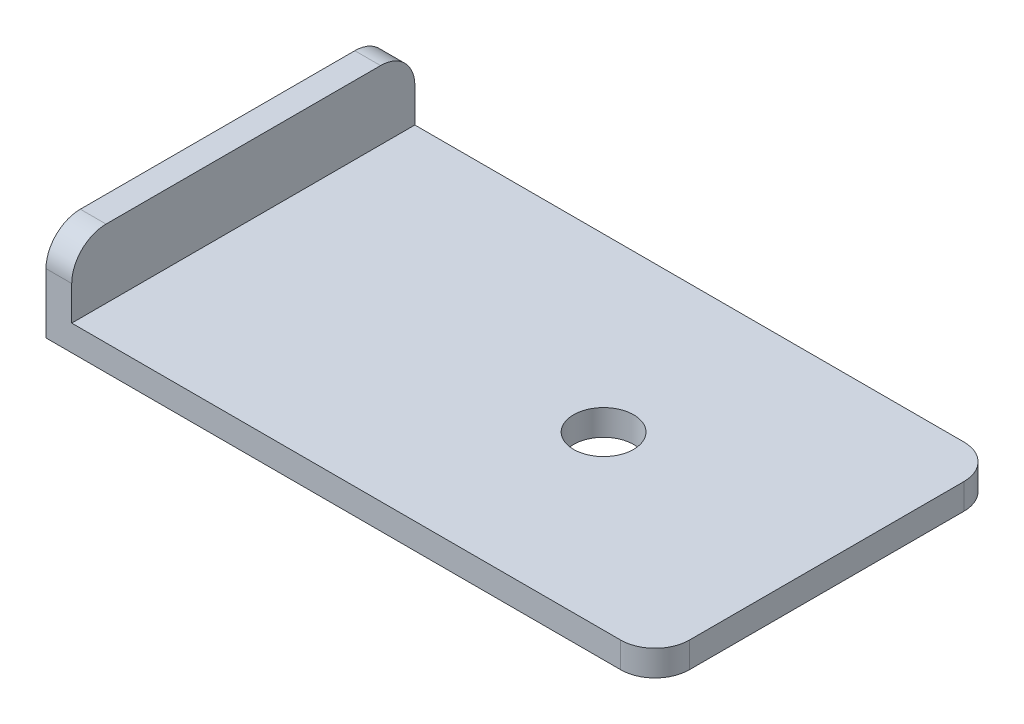
ISO-10303-21;
HEADER;
FILE_DESCRIPTION(('STEP AP214'),'2;1');
FILE_NAME('part.step','',(''),(''),'','','');
FILE_SCHEMA(('AUTOMOTIVE_DESIGN { 1 0 10303 214 1 1 1 1 }'));
ENDSEC;
DATA;
#1=APPLICATION_CONTEXT('core data for automotive mechanical design processes');
#2=APPLICATION_PROTOCOL_DEFINITION('international standard','automotive_design',2000,#1);
#3=PRODUCT_CONTEXT('',#1,'mechanical');
#4=PRODUCT('Part','Part','',(#3));
#5=PRODUCT_RELATED_PRODUCT_CATEGORY('part','',(#4));
#6=PRODUCT_DEFINITION_FORMATION('','',#4);
#7=PRODUCT_DEFINITION_CONTEXT('part definition',#1,'design');
#8=PRODUCT_DEFINITION('design','',#6,#7);
#9=PRODUCT_DEFINITION_SHAPE('','',#8);
#10=(LENGTH_UNIT() NAMED_UNIT(*) SI_UNIT(.MILLI.,.METRE.));
#11=(NAMED_UNIT(*) PLANE_ANGLE_UNIT() SI_UNIT($,.RADIAN.));
#12=(NAMED_UNIT(*) SI_UNIT($,.STERADIAN.) SOLID_ANGLE_UNIT());
#13=UNCERTAINTY_MEASURE_WITH_UNIT(LENGTH_MEASURE(1.E-05),#10,'distance_accuracy_value','');
#14=(GEOMETRIC_REPRESENTATION_CONTEXT(3) GLOBAL_UNCERTAINTY_ASSIGNED_CONTEXT((#13)) GLOBAL_UNIT_ASSIGNED_CONTEXT((#10,
#11,#12)) REPRESENTATION_CONTEXT('',''));
#15=CARTESIAN_POINT('',(0.,0.,0.));
#16=DIRECTION('',(0.,0.,1.));
#17=DIRECTION('',(1.,0.,0.));
#18=AXIS2_PLACEMENT_3D('',#15,#16,#17);
#19=CARTESIAN_POINT('',(0.,0.,20.));
#20=DIRECTION('',(0.,1.,0.));
#21=DIRECTION('',(0.,0.,1.));
#22=AXIS2_PLACEMENT_3D('',#19,#20,#21);
#23=PLANE('',#22);
#24=CARTESIAN_POINT('',(22.5,0.,10.));
#25=DIRECTION('',(0.,1.,0.));
#26=DIRECTION('',(0.,0.,1.));
#27=AXIS2_PLACEMENT_3D('',#24,#25,#26);
#28=CIRCLE('',#27,1.75);
#29=CARTESIAN_POINT('',(22.5,0.,11.75));
#30=VERTEX_POINT('',#29);
#31=EDGE_CURVE('E148',#30,#30,#28,.T.);
#32=ORIENTED_EDGE('',*,*,#31,.T.);
#33=EDGE_LOOP('',(#32));
#34=FACE_BOUND('',#33,.T.);
#35=DIRECTION('',(1.,0.,0.));
#36=VECTOR('',#35,1.);
#37=CARTESIAN_POINT('',(0.,0.,0.));
#38=LINE('',#37,#36);
#39=CARTESIAN_POINT('',(0.,0.,0.));
#40=VERTEX_POINT('',#39);
#41=CARTESIAN_POINT('',(33.5,0.,0.));
#42=VERTEX_POINT('',#41);
#43=EDGE_CURVE('E145',#40,#42,#38,.T.);
#44=ORIENTED_EDGE('',*,*,#43,.T.);
#45=CARTESIAN_POINT('',(33.5,0.,2.));
#46=DIRECTION('',(0.,1.,0.));
#47=DIRECTION('',(0.,0.,1.));
#48=AXIS2_PLACEMENT_3D('',#45,#46,#47);
#49=CIRCLE('',#48,2.);
#50=CARTESIAN_POINT('',(35.5,0.,2.));
#51=VERTEX_POINT('',#50);
#52=EDGE_CURVE('E167',#42,#51,#49,.F.);
#53=ORIENTED_EDGE('',*,*,#52,.T.);
#54=DIRECTION('',(0.,0.,-1.));
#55=VECTOR('',#54,1.);
#56=CARTESIAN_POINT('',(35.5,0.,20.));
#57=LINE('',#56,#55);
#58=CARTESIAN_POINT('',(35.5,0.,18.));
#59=VERTEX_POINT('',#58);
#60=EDGE_CURVE('E156',#59,#51,#57,.T.);
#61=ORIENTED_EDGE('',*,*,#60,.F.);
#62=CARTESIAN_POINT('',(33.5,0.,18.));
#63=DIRECTION('',(0.,1.,0.));
#64=DIRECTION('',(0.,0.,1.));
#65=AXIS2_PLACEMENT_3D('',#62,#63,#64);
#66=CIRCLE('',#65,2.);
#67=CARTESIAN_POINT('',(33.5,0.,20.));
#68=VERTEX_POINT('',#67);
#69=EDGE_CURVE('E165',#59,#68,#66,.F.);
#70=ORIENTED_EDGE('',*,*,#69,.T.);
#71=DIRECTION('',(1.,0.,0.));
#72=VECTOR('',#71,1.);
#73=CARTESIAN_POINT('',(0.,0.,20.));
#74=LINE('',#73,#72);
#75=CARTESIAN_POINT('',(0.,0.,20.));
#76=VERTEX_POINT('',#75);
#77=EDGE_CURVE('E138',#76,#68,#74,.T.);
#78=ORIENTED_EDGE('',*,*,#77,.F.);
#79=DIRECTION('',(0.,0.,-1.));
#80=VECTOR('',#79,1.);
#81=CARTESIAN_POINT('',(0.,0.,20.));
#82=LINE('',#81,#80);
#83=EDGE_CURVE('E132',#76,#40,#82,.T.);
#84=ORIENTED_EDGE('',*,*,#83,.T.);
#85=EDGE_LOOP('',(#44,#53,#61,#70,#78,#84));
#86=FACE_BOUND('',#85,.T.);
#87=ADVANCED_FACE('F33',(#34,#86),#23,.F.);
#88=CARTESIAN_POINT('',(35.5,1.5,20.));
#89=DIRECTION('',(1.,0.,0.));
#90=DIRECTION('',(0.,0.,-1.));
#91=AXIS2_PLACEMENT_3D('',#88,#89,#90);
#92=PLANE('',#91);
#93=ORIENTED_EDGE('',*,*,#60,.T.);
#94=DIRECTION('',(0.,-1.,0.));
#95=VECTOR('',#94,1.);
#96=CARTESIAN_POINT('',(35.5,1.5,2.));
#97=LINE('',#96,#95);
#98=CARTESIAN_POINT('',(35.5,1.5,2.));
#99=VERTEX_POINT('',#98);
#100=EDGE_CURVE('E172',#51,#99,#97,.F.);
#101=ORIENTED_EDGE('',*,*,#100,.T.);
#102=DIRECTION('',(0.,0.,-1.));
#103=VECTOR('',#102,1.);
#104=CARTESIAN_POINT('',(35.5,1.5,20.));
#105=LINE('',#104,#103);
#106=CARTESIAN_POINT('',(35.5,1.5,18.));
#107=VERTEX_POINT('',#106);
#108=EDGE_CURVE('E131',#107,#99,#105,.T.);
#109=ORIENTED_EDGE('',*,*,#108,.F.);
#110=DIRECTION('',(0.,-1.,0.));
#111=VECTOR('',#110,1.);
#112=CARTESIAN_POINT('',(35.5,0.,18.));
#113=LINE('',#112,#111);
#114=EDGE_CURVE('E169',#107,#59,#113,.T.);
#115=ORIENTED_EDGE('',*,*,#114,.T.);
#116=EDGE_LOOP('',(#93,#101,#109,#115));
#117=FACE_BOUND('',#116,.T.);
#118=ADVANCED_FACE('F210',(#117),#92,.T.);
#119=CARTESIAN_POINT('',(0.,1.5,20.));
#120=DIRECTION('',(0.,1.,0.));
#121=DIRECTION('',(0.,0.,1.));
#122=AXIS2_PLACEMENT_3D('',#119,#120,#121);
#123=PLANE('',#122);
#124=CARTESIAN_POINT('',(22.5,1.5,10.));
#125=DIRECTION('',(0.,1.,0.));
#126=DIRECTION('',(0.,0.,1.));
#127=AXIS2_PLACEMENT_3D('',#124,#125,#126);
#128=CIRCLE('',#127,1.75);
#129=CARTESIAN_POINT('',(22.5,1.5,11.75));
#130=VERTEX_POINT('',#129);
#131=EDGE_CURVE('E192',#130,#130,#128,.T.);
#132=ORIENTED_EDGE('',*,*,#131,.F.);
#133=EDGE_LOOP('',(#132));
#134=FACE_BOUND('',#133,.T.);
#135=ORIENTED_EDGE('',*,*,#108,.T.);
#136=CARTESIAN_POINT('',(33.5,1.5,2.));
#137=DIRECTION('',(0.,1.,0.));
#138=DIRECTION('',(0.,0.,1.));
#139=AXIS2_PLACEMENT_3D('',#136,#137,#138);
#140=CIRCLE('',#139,2.);
#141=CARTESIAN_POINT('',(33.5,1.5,0.));
#142=VERTEX_POINT('',#141);
#143=EDGE_CURVE('E176',#99,#142,#140,.T.);
#144=ORIENTED_EDGE('',*,*,#143,.T.);
#145=DIRECTION('',(1.,0.,0.));
#146=VECTOR('',#145,1.);
#147=CARTESIAN_POINT('',(0.,1.5,0.));
#148=LINE('',#147,#146);
#149=CARTESIAN_POINT('',(1.5,1.5,0.));
#150=VERTEX_POINT('',#149);
#151=EDGE_CURVE('E130',#150,#142,#148,.T.);
#152=ORIENTED_EDGE('',*,*,#151,.F.);
#153=DIRECTION('',(0.,0.,-1.));
#154=VECTOR('',#153,1.);
#155=CARTESIAN_POINT('',(1.5,1.5,20.));
#156=LINE('',#155,#154);
#157=CARTESIAN_POINT('',(1.5,1.5,20.));
#158=VERTEX_POINT('',#157);
#159=EDGE_CURVE('E114',#158,#150,#156,.T.);
#160=ORIENTED_EDGE('',*,*,#159,.F.);
#161=DIRECTION('',(1.,0.,0.));
#162=VECTOR('',#161,1.);
#163=CARTESIAN_POINT('',(0.,1.5,20.));
#164=LINE('',#163,#162);
#165=CARTESIAN_POINT('',(33.5,1.5,20.));
#166=VERTEX_POINT('',#165);
#167=EDGE_CURVE('E122',#158,#166,#164,.T.);
#168=ORIENTED_EDGE('',*,*,#167,.T.);
#169=CARTESIAN_POINT('',(33.5,1.5,18.));
#170=DIRECTION('',(0.,1.,0.));
#171=DIRECTION('',(0.,0.,1.));
#172=AXIS2_PLACEMENT_3D('',#169,#170,#171);
#173=CIRCLE('',#172,2.);
#174=EDGE_CURVE('E174',#166,#107,#173,.T.);
#175=ORIENTED_EDGE('',*,*,#174,.T.);
#176=EDGE_LOOP('',(#135,#144,#152,#160,#168,#175));
#177=FACE_BOUND('',#176,.T.);
#178=ADVANCED_FACE('F127',(#134,#177),#123,.T.);
#179=CARTESIAN_POINT('',(1.5,19.5,20.));
#180=DIRECTION('',(1.,0.,0.));
#181=DIRECTION('',(0.,1.,0.));
#182=AXIS2_PLACEMENT_3D('',#179,#180,#181);
#183=PLANE('',#182);
#184=DIRECTION('',(0.,-1.,0.));
#185=VECTOR('',#184,1.);
#186=CARTESIAN_POINT('',(1.5,19.5,0.));
#187=LINE('',#186,#185);
#188=CARTESIAN_POINT('',(1.5,3.5,0.));
#189=VERTEX_POINT('',#188);
#190=EDGE_CURVE('E150',#189,#150,#187,.T.);
#191=ORIENTED_EDGE('',*,*,#190,.F.);
#192=CARTESIAN_POINT('',(1.5,3.5,2.));
#193=DIRECTION('',(1.,0.,0.));
#194=DIRECTION('',(0.,1.,0.));
#195=AXIS2_PLACEMENT_3D('',#192,#193,#194);
#196=CIRCLE('',#195,2.);
#197=CARTESIAN_POINT('',(1.5,5.5,2.));
#198=VERTEX_POINT('',#197);
#199=EDGE_CURVE('E182',#189,#198,#196,.T.);
#200=ORIENTED_EDGE('',*,*,#199,.T.);
#201=DIRECTION('',(0.,0.,1.));
#202=VECTOR('',#201,1.);
#203=CARTESIAN_POINT('',(1.5,5.5,0.));
#204=LINE('',#203,#202);
#205=CARTESIAN_POINT('',(1.5,5.5,18.));
#206=VERTEX_POINT('',#205);
#207=EDGE_CURVE('E189',#198,#206,#204,.T.);
#208=ORIENTED_EDGE('',*,*,#207,.T.);
#209=CARTESIAN_POINT('',(1.5,3.5,18.));
#210=DIRECTION('',(1.,0.,0.));
#211=DIRECTION('',(0.,1.,0.));
#212=AXIS2_PLACEMENT_3D('',#209,#210,#211);
#213=CIRCLE('',#212,2.);
#214=CARTESIAN_POINT('',(1.5,3.5,20.));
#215=VERTEX_POINT('',#214);
#216=EDGE_CURVE('E117',#206,#215,#213,.T.);
#217=ORIENTED_EDGE('',*,*,#216,.T.);
#218=DIRECTION('',(0.,-1.,0.));
#219=VECTOR('',#218,1.);
#220=CARTESIAN_POINT('',(1.5,19.5,20.));
#221=LINE('',#220,#219);
#222=EDGE_CURVE('E110',#215,#158,#221,.T.);
#223=ORIENTED_EDGE('',*,*,#222,.T.);
#224=ORIENTED_EDGE('',*,*,#159,.T.);
#225=EDGE_LOOP('',(#191,#200,#208,#217,#223,#224));
#226=FACE_BOUND('',#225,.T.);
#227=ADVANCED_FACE('F113',(#226),#183,.T.);
#228=CARTESIAN_POINT('',(0.,19.5,20.));
#229=DIRECTION('',(1.,0.,0.));
#230=DIRECTION('',(0.,1.,0.));
#231=AXIS2_PLACEMENT_3D('',#228,#229,#230);
#232=PLANE('',#231);
#233=DIRECTION('',(0.,0.,1.));
#234=VECTOR('',#233,1.);
#235=CARTESIAN_POINT('',(0.,5.5,0.));
#236=LINE('',#235,#234);
#237=CARTESIAN_POINT('',(0.,5.5,2.));
#238=VERTEX_POINT('',#237);
#239=CARTESIAN_POINT('',(0.,5.5,18.));
#240=VERTEX_POINT('',#239);
#241=EDGE_CURVE('E190',#238,#240,#236,.T.);
#242=ORIENTED_EDGE('',*,*,#241,.F.);
#243=CARTESIAN_POINT('',(0.,3.5,2.));
#244=DIRECTION('',(1.,0.,0.));
#245=DIRECTION('',(0.,1.,0.));
#246=AXIS2_PLACEMENT_3D('',#243,#244,#245);
#247=CIRCLE('',#246,2.);
#248=CARTESIAN_POINT('',(0.,3.5,0.));
#249=VERTEX_POINT('',#248);
#250=EDGE_CURVE('E11',#238,#249,#247,.F.);
#251=ORIENTED_EDGE('',*,*,#250,.T.);
#252=DIRECTION('',(0.,-1.,0.));
#253=VECTOR('',#252,1.);
#254=CARTESIAN_POINT('',(0.,19.5,0.));
#255=LINE('',#254,#253);
#256=EDGE_CURVE('E140',#249,#40,#255,.T.);
#257=ORIENTED_EDGE('',*,*,#256,.T.);
#258=ORIENTED_EDGE('',*,*,#83,.F.);
#259=DIRECTION('',(0.,-1.,0.));
#260=VECTOR('',#259,1.);
#261=CARTESIAN_POINT('',(0.,19.5,20.));
#262=LINE('',#261,#260);
#263=CARTESIAN_POINT('',(0.,3.5,20.));
#264=VERTEX_POINT('',#263);
#265=EDGE_CURVE('E121',#264,#76,#262,.T.);
#266=ORIENTED_EDGE('',*,*,#265,.F.);
#267=CARTESIAN_POINT('',(0.,3.5,18.));
#268=DIRECTION('',(1.,0.,0.));
#269=DIRECTION('',(0.,1.,0.));
#270=AXIS2_PLACEMENT_3D('',#267,#268,#269);
#271=CIRCLE('',#270,2.);
#272=EDGE_CURVE('E41',#264,#240,#271,.F.);
#273=ORIENTED_EDGE('',*,*,#272,.T.);
#274=EDGE_LOOP('',(#242,#251,#257,#258,#266,#273));
#275=FACE_BOUND('',#274,.T.);
#276=ADVANCED_FACE('F216',(#275),#232,.F.);
#277=CARTESIAN_POINT('',(0.,0.,20.));
#278=DIRECTION('',(0.,0.,-1.));
#279=DIRECTION('',(-1.,0.,0.));
#280=AXIS2_PLACEMENT_3D('',#277,#278,#279);
#281=PLANE('',#280);
#282=ORIENTED_EDGE('',*,*,#77,.T.);
#283=DIRECTION('',(0.,-1.,0.));
#284=VECTOR('',#283,1.);
#285=CARTESIAN_POINT('',(33.5,1.5,20.));
#286=LINE('',#285,#284);
#287=EDGE_CURVE('E137',#68,#166,#286,.F.);
#288=ORIENTED_EDGE('',*,*,#287,.T.);
#289=ORIENTED_EDGE('',*,*,#167,.F.);
#290=ORIENTED_EDGE('',*,*,#222,.F.);
#291=DIRECTION('',(1.,0.,0.));
#292=VECTOR('',#291,1.);
#293=CARTESIAN_POINT('',(0.,3.5,20.));
#294=LINE('',#293,#292);
#295=EDGE_CURVE('E178',#215,#264,#294,.F.);
#296=ORIENTED_EDGE('',*,*,#295,.T.);
#297=ORIENTED_EDGE('',*,*,#265,.T.);
#298=EDGE_LOOP('',(#282,#288,#289,#290,#296,#297));
#299=FACE_BOUND('',#298,.T.);
#300=ADVANCED_FACE('F135',(#299),#281,.F.);
#301=CARTESIAN_POINT('',(0.,0.,0.));
#302=DIRECTION('',(0.,0.,-1.));
#303=DIRECTION('',(-1.,0.,0.));
#304=AXIS2_PLACEMENT_3D('',#301,#302,#303);
#305=PLANE('',#304);
#306=ORIENTED_EDGE('',*,*,#151,.T.);
#307=DIRECTION('',(0.,-1.,0.));
#308=VECTOR('',#307,1.);
#309=CARTESIAN_POINT('',(33.5,0.,0.));
#310=LINE('',#309,#308);
#311=EDGE_CURVE('E162',#142,#42,#310,.T.);
#312=ORIENTED_EDGE('',*,*,#311,.T.);
#313=ORIENTED_EDGE('',*,*,#43,.F.);
#314=ORIENTED_EDGE('',*,*,#256,.F.);
#315=DIRECTION('',(1.,0.,0.));
#316=VECTOR('',#315,1.);
#317=CARTESIAN_POINT('',(1.5,3.5,0.));
#318=LINE('',#317,#316);
#319=EDGE_CURVE('E159',#249,#189,#318,.T.);
#320=ORIENTED_EDGE('',*,*,#319,.T.);
#321=ORIENTED_EDGE('',*,*,#190,.T.);
#322=EDGE_LOOP('',(#306,#312,#313,#314,#320,#321));
#323=FACE_BOUND('',#322,.T.);
#324=ADVANCED_FACE('F205',(#323),#305,.T.);
#325=CARTESIAN_POINT('',(22.5,0.,10.));
#326=DIRECTION('',(0.,1.,0.));
#327=DIRECTION('',(0.,0.,1.));
#328=AXIS2_PLACEMENT_3D('',#325,#326,#327);
#329=CYLINDRICAL_SURFACE('',#328,1.75);
#330=ORIENTED_EDGE('',*,*,#31,.F.);
#331=EDGE_LOOP('',(#330));
#332=FACE_BOUND('',#331,.T.);
#333=ORIENTED_EDGE('',*,*,#131,.T.);
#334=EDGE_LOOP('',(#333));
#335=FACE_BOUND('',#334,.T.);
#336=ADVANCED_FACE('F202',(#332,#335),#329,.F.);
#337=CARTESIAN_POINT('',(0.,5.5,0.));
#338=DIRECTION('',(0.,-1.,0.));
#339=DIRECTION('',(0.,0.,-1.));
#340=AXIS2_PLACEMENT_3D('',#337,#338,#339);
#341=PLANE('',#340);
#342=ORIENTED_EDGE('',*,*,#207,.F.);
#343=DIRECTION('',(1.,0.,0.));
#344=VECTOR('',#343,1.);
#345=CARTESIAN_POINT('',(0.,5.5,2.));
#346=LINE('',#345,#344);
#347=EDGE_CURVE('E54',#198,#238,#346,.F.);
#348=ORIENTED_EDGE('',*,*,#347,.T.);
#349=ORIENTED_EDGE('',*,*,#241,.T.);
#350=DIRECTION('',(1.,0.,0.));
#351=VECTOR('',#350,1.);
#352=CARTESIAN_POINT('',(0.,5.5,18.));
#353=LINE('',#352,#351);
#354=EDGE_CURVE('E184',#240,#206,#353,.T.);
#355=ORIENTED_EDGE('',*,*,#354,.T.);
#356=EDGE_LOOP('',(#342,#348,#349,#355));
#357=FACE_BOUND('',#356,.T.);
#358=ADVANCED_FACE('F188',(#357),#341,.F.);
#359=CARTESIAN_POINT('',(33.5,0.,2.));
#360=DIRECTION('',(0.,-1.,0.));
#361=DIRECTION('',(0.,0.,-1.));
#362=AXIS2_PLACEMENT_3D('',#359,#360,#361);
#363=CYLINDRICAL_SURFACE('',#362,2.);
#364=ORIENTED_EDGE('',*,*,#143,.F.);
#365=ORIENTED_EDGE('',*,*,#100,.F.);
#366=ORIENTED_EDGE('',*,*,#52,.F.);
#367=ORIENTED_EDGE('',*,*,#311,.F.);
#368=EDGE_LOOP('',(#364,#365,#366,#367));
#369=FACE_BOUND('',#368,.T.);
#370=ADVANCED_FACE('F225',(#369),#363,.T.);
#371=CARTESIAN_POINT('',(33.5,1.5,18.));
#372=DIRECTION('',(0.,1.,0.));
#373=DIRECTION('',(0.,0.,1.));
#374=AXIS2_PLACEMENT_3D('',#371,#372,#373);
#375=CYLINDRICAL_SURFACE('',#374,2.);
#376=ORIENTED_EDGE('',*,*,#174,.F.);
#377=ORIENTED_EDGE('',*,*,#287,.F.);
#378=ORIENTED_EDGE('',*,*,#69,.F.);
#379=ORIENTED_EDGE('',*,*,#114,.F.);
#380=EDGE_LOOP('',(#376,#377,#378,#379));
#381=FACE_BOUND('',#380,.T.);
#382=ADVANCED_FACE('F228',(#381),#375,.T.);
#383=CARTESIAN_POINT('',(0.,3.5,2.));
#384=DIRECTION('',(-1.,0.,0.));
#385=DIRECTION('',(0.,0.,1.));
#386=AXIS2_PLACEMENT_3D('',#383,#384,#385);
#387=CYLINDRICAL_SURFACE('',#386,2.);
#388=ORIENTED_EDGE('',*,*,#250,.F.);
#389=ORIENTED_EDGE('',*,*,#347,.F.);
#390=ORIENTED_EDGE('',*,*,#199,.F.);
#391=ORIENTED_EDGE('',*,*,#319,.F.);
#392=EDGE_LOOP('',(#388,#389,#390,#391));
#393=FACE_BOUND('',#392,.T.);
#394=ADVANCED_FACE('F231',(#393),#387,.T.);
#395=CARTESIAN_POINT('',(0.,3.5,18.));
#396=DIRECTION('',(1.,0.,0.));
#397=DIRECTION('',(0.,0.,-1.));
#398=AXIS2_PLACEMENT_3D('',#395,#396,#397);
#399=CYLINDRICAL_SURFACE('',#398,2.);
#400=ORIENTED_EDGE('',*,*,#272,.F.);
#401=ORIENTED_EDGE('',*,*,#295,.F.);
#402=ORIENTED_EDGE('',*,*,#216,.F.);
#403=ORIENTED_EDGE('',*,*,#354,.F.);
#404=EDGE_LOOP('',(#400,#401,#402,#403));
#405=FACE_BOUND('',#404,.T.);
#406=ADVANCED_FACE('F35',(#405),#399,.T.);
#407=CLOSED_SHELL('',(#87,#118,#178,#227,#276,#300,#324,#336,#358,#370,#382,#394,#406));
#408=MANIFOLD_SOLID_BREP('B2',#407);
#409=ADVANCED_BREP_SHAPE_REPRESENTATION('',(#18,#408),#14);
#410=SHAPE_DEFINITION_REPRESENTATION(#9,#409);
ENDSEC;
END-ISO-10303-21;
